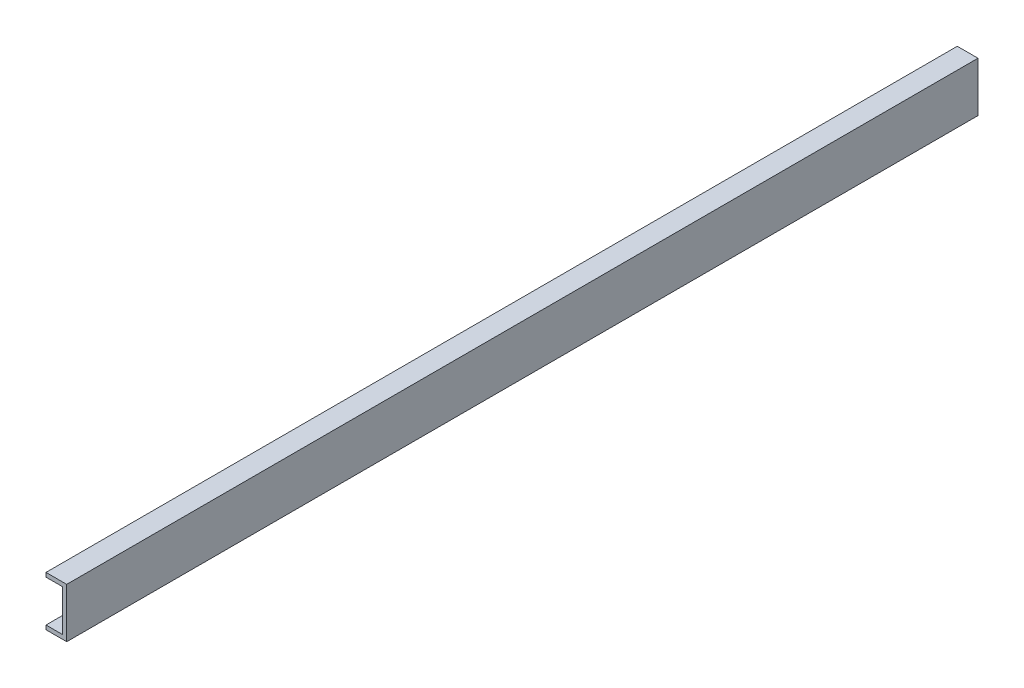
ISO-10303-21;
HEADER;
FILE_DESCRIPTION(('STEP AP214'),'2;1');
FILE_NAME('part.step','',(''),(''),'','','');
FILE_SCHEMA(('AUTOMOTIVE_DESIGN { 1 0 10303 214 1 1 1 1 }'));
ENDSEC;
DATA;
#1=APPLICATION_CONTEXT('core data for automotive mechanical design processes');
#2=APPLICATION_PROTOCOL_DEFINITION('international standard','automotive_design',2000,#1);
#3=PRODUCT_CONTEXT('',#1,'mechanical');
#4=PRODUCT('Part','Part','',(#3));
#5=PRODUCT_RELATED_PRODUCT_CATEGORY('part','',(#4));
#6=PRODUCT_DEFINITION_FORMATION('','',#4);
#7=PRODUCT_DEFINITION_CONTEXT('part definition',#1,'design');
#8=PRODUCT_DEFINITION('design','',#6,#7);
#9=PRODUCT_DEFINITION_SHAPE('','',#8);
#10=(LENGTH_UNIT() NAMED_UNIT(*) SI_UNIT(.MILLI.,.METRE.));
#11=(NAMED_UNIT(*) PLANE_ANGLE_UNIT() SI_UNIT($,.RADIAN.));
#12=(NAMED_UNIT(*) SI_UNIT($,.STERADIAN.) SOLID_ANGLE_UNIT());
#13=UNCERTAINTY_MEASURE_WITH_UNIT(LENGTH_MEASURE(1.E-05),#10,'distance_accuracy_value','');
#14=(GEOMETRIC_REPRESENTATION_CONTEXT(3) GLOBAL_UNCERTAINTY_ASSIGNED_CONTEXT((#13)) GLOBAL_UNIT_ASSIGNED_CONTEXT((#10,
#11,#12)) REPRESENTATION_CONTEXT('',''));
#15=CARTESIAN_POINT('',(0.,0.,0.));
#16=DIRECTION('',(0.,0.,1.));
#17=DIRECTION('',(1.,0.,0.));
#18=AXIS2_PLACEMENT_3D('',#15,#16,#17);
#19=CARTESIAN_POINT('',(-6.35,-15.24,558.8));
#20=DIRECTION('',(1.,0.,0.));
#21=DIRECTION('',(0.,0.,-1.));
#22=AXIS2_PLACEMENT_3D('',#19,#20,#21);
#23=PLANE('',#22);
#24=DIRECTION('',(0.,-1.,0.));
#25=VECTOR('',#24,1.);
#26=CARTESIAN_POINT('',(-6.35,-15.24,0.));
#27=LINE('',#26,#25);
#28=CARTESIAN_POINT('',(-6.35,15.24,0.));
#29=VERTEX_POINT('',#28);
#30=CARTESIAN_POINT('',(-6.35,12.7,0.));
#31=VERTEX_POINT('',#30);
#32=EDGE_CURVE('E132',#29,#31,#27,.T.);
#33=ORIENTED_EDGE('',*,*,#32,.T.);
#34=DIRECTION('',(0.,0.,1.));
#35=VECTOR('',#34,1.);
#36=CARTESIAN_POINT('',(-6.35,12.7,0.));
#37=LINE('',#36,#35);
#38=CARTESIAN_POINT('',(-6.35,12.7,558.8));
#39=VERTEX_POINT('',#38);
#40=EDGE_CURVE('E163',#31,#39,#37,.T.);
#41=ORIENTED_EDGE('',*,*,#40,.T.);
#42=DIRECTION('',(0.,-1.,0.));
#43=VECTOR('',#42,1.);
#44=CARTESIAN_POINT('',(-6.35,-15.24,558.8));
#45=LINE('',#44,#43);
#46=CARTESIAN_POINT('',(-6.35,15.24,558.8));
#47=VERTEX_POINT('',#46);
#48=EDGE_CURVE('E151',#47,#39,#45,.T.);
#49=ORIENTED_EDGE('',*,*,#48,.F.);
#50=DIRECTION('',(0.,0.,-1.));
#51=VECTOR('',#50,1.);
#52=CARTESIAN_POINT('',(-6.35,15.24,558.8));
#53=LINE('',#52,#51);
#54=EDGE_CURVE('E45',#47,#29,#53,.T.);
#55=ORIENTED_EDGE('',*,*,#54,.T.);
#56=EDGE_LOOP('',(#33,#41,#49,#55));
#57=FACE_BOUND('',#56,.T.);
#58=ADVANCED_FACE('F37',(#57),#23,.F.);
#59=CARTESIAN_POINT('',(6.35,-15.24,558.8));
#60=DIRECTION('',(-1.,0.,0.));
#61=DIRECTION('',(0.,0.,1.));
#62=AXIS2_PLACEMENT_3D('',#59,#60,#61);
#63=PLANE('',#62);
#64=DIRECTION('',(0.,1.,0.));
#65=VECTOR('',#64,1.);
#66=CARTESIAN_POINT('',(6.35,-15.24,0.));
#67=LINE('',#66,#65);
#68=CARTESIAN_POINT('',(6.35,-15.24,0.));
#69=VERTEX_POINT('',#68);
#70=CARTESIAN_POINT('',(6.35,15.24,0.));
#71=VERTEX_POINT('',#70);
#72=EDGE_CURVE('E136',#69,#71,#67,.T.);
#73=ORIENTED_EDGE('',*,*,#72,.T.);
#74=DIRECTION('',(0.,0.,-1.));
#75=VECTOR('',#74,1.);
#76=CARTESIAN_POINT('',(6.35,15.24,558.8));
#77=LINE('',#76,#75);
#78=CARTESIAN_POINT('',(6.35,15.24,558.8));
#79=VERTEX_POINT('',#78);
#80=EDGE_CURVE('E11',#79,#71,#77,.T.);
#81=ORIENTED_EDGE('',*,*,#80,.F.);
#82=DIRECTION('',(0.,1.,0.));
#83=VECTOR('',#82,1.);
#84=CARTESIAN_POINT('',(6.35,-15.24,558.8));
#85=LINE('',#84,#83);
#86=CARTESIAN_POINT('',(6.35,-15.24,558.8));
#87=VERTEX_POINT('',#86);
#88=EDGE_CURVE('E141',#87,#79,#85,.T.);
#89=ORIENTED_EDGE('',*,*,#88,.F.);
#90=DIRECTION('',(0.,0.,-1.));
#91=VECTOR('',#90,1.);
#92=CARTESIAN_POINT('',(6.35,-15.24,558.8));
#93=LINE('',#92,#91);
#94=EDGE_CURVE('E142',#87,#69,#93,.T.);
#95=ORIENTED_EDGE('',*,*,#94,.T.);
#96=EDGE_LOOP('',(#73,#81,#89,#95));
#97=FACE_BOUND('',#96,.T.);
#98=ADVANCED_FACE('F39',(#97),#63,.F.);
#99=CARTESIAN_POINT('',(-6.35,15.24,558.8));
#100=DIRECTION('',(0.,-1.,0.));
#101=DIRECTION('',(0.,0.,-1.));
#102=AXIS2_PLACEMENT_3D('',#99,#100,#101);
#103=PLANE('',#102);
#104=DIRECTION('',(-1.,0.,0.));
#105=VECTOR('',#104,1.);
#106=CARTESIAN_POINT('',(-6.35,15.24,0.));
#107=LINE('',#106,#105);
#108=EDGE_CURVE('E133',#71,#29,#107,.T.);
#109=ORIENTED_EDGE('',*,*,#108,.T.);
#110=ORIENTED_EDGE('',*,*,#54,.F.);
#111=DIRECTION('',(-1.,0.,0.));
#112=VECTOR('',#111,1.);
#113=CARTESIAN_POINT('',(-6.35,15.24,558.8));
#114=LINE('',#113,#112);
#115=EDGE_CURVE('E89',#79,#47,#114,.T.);
#116=ORIENTED_EDGE('',*,*,#115,.F.);
#117=ORIENTED_EDGE('',*,*,#80,.T.);
#118=EDGE_LOOP('',(#109,#110,#116,#117));
#119=FACE_BOUND('',#118,.T.);
#120=ADVANCED_FACE('F184',(#119),#103,.F.);
#121=CARTESIAN_POINT('',(-6.34999999999999,-12.7,558.8));
#122=VERTEX_POINT('',#121);
#123=CARTESIAN_POINT('',(-6.35,-15.24,558.8));
#124=VERTEX_POINT('',#123);
#125=EDGE_CURVE('E126',#122,#124,#45,.T.);
#126=ORIENTED_EDGE('',*,*,#125,.F.);
#127=DIRECTION('',(0.,0.,1.));
#128=VECTOR('',#127,1.);
#129=CARTESIAN_POINT('',(-6.34999999999999,-12.7,0.));
#130=LINE('',#129,#128);
#131=CARTESIAN_POINT('',(-6.34999999999999,-12.7,0.));
#132=VERTEX_POINT('',#131);
#133=EDGE_CURVE('E114',#132,#122,#130,.T.);
#134=ORIENTED_EDGE('',*,*,#133,.F.);
#135=CARTESIAN_POINT('',(-6.35,-15.24,0.));
#136=VERTEX_POINT('',#135);
#137=EDGE_CURVE('E125',#132,#136,#27,.T.);
#138=ORIENTED_EDGE('',*,*,#137,.T.);
#139=DIRECTION('',(0.,0.,-1.));
#140=VECTOR('',#139,1.);
#141=CARTESIAN_POINT('',(-6.35,-15.24,558.8));
#142=LINE('',#141,#140);
#143=EDGE_CURVE('E144',#124,#136,#142,.T.);
#144=ORIENTED_EDGE('',*,*,#143,.F.);
#145=EDGE_LOOP('',(#126,#134,#138,#144));
#146=FACE_BOUND('',#145,.T.);
#147=ADVANCED_FACE('F123',(#146),#23,.F.);
#148=CARTESIAN_POINT('',(-6.35,-15.24,558.8));
#149=DIRECTION('',(0.,1.,0.));
#150=DIRECTION('',(0.,0.,1.));
#151=AXIS2_PLACEMENT_3D('',#148,#149,#150);
#152=PLANE('',#151);
#153=DIRECTION('',(1.,0.,0.));
#154=VECTOR('',#153,1.);
#155=CARTESIAN_POINT('',(-6.35,-15.24,0.));
#156=LINE('',#155,#154);
#157=EDGE_CURVE('E82',#136,#69,#156,.T.);
#158=ORIENTED_EDGE('',*,*,#157,.T.);
#159=ORIENTED_EDGE('',*,*,#94,.F.);
#160=DIRECTION('',(1.,0.,0.));
#161=VECTOR('',#160,1.);
#162=CARTESIAN_POINT('',(-6.35,-15.24,558.8));
#163=LINE('',#162,#161);
#164=EDGE_CURVE('E61',#124,#87,#163,.T.);
#165=ORIENTED_EDGE('',*,*,#164,.F.);
#166=ORIENTED_EDGE('',*,*,#143,.T.);
#167=EDGE_LOOP('',(#158,#159,#165,#166));
#168=FACE_BOUND('',#167,.T.);
#169=ADVANCED_FACE('F175',(#168),#152,.F.);
#170=CARTESIAN_POINT('',(0.,0.,558.8));
#171=DIRECTION('',(0.,0.,-1.));
#172=DIRECTION('',(-1.,0.,0.));
#173=AXIS2_PLACEMENT_3D('',#170,#171,#172);
#174=PLANE('',#173);
#175=ORIENTED_EDGE('',*,*,#48,.T.);
#176=DIRECTION('',(-1.,0.,0.));
#177=VECTOR('',#176,1.);
#178=CARTESIAN_POINT('',(-6.35,12.7,558.8));
#179=LINE('',#178,#177);
#180=CARTESIAN_POINT('',(3.81,12.7,558.8));
#181=VERTEX_POINT('',#180);
#182=EDGE_CURVE('E119',#181,#39,#179,.T.);
#183=ORIENTED_EDGE('',*,*,#182,.F.);
#184=DIRECTION('',(0.,1.,0.));
#185=VECTOR('',#184,1.);
#186=CARTESIAN_POINT('',(3.81,12.7,558.8));
#187=LINE('',#186,#185);
#188=CARTESIAN_POINT('',(3.81000000000001,-12.7,558.8));
#189=VERTEX_POINT('',#188);
#190=EDGE_CURVE('E159',#189,#181,#187,.T.);
#191=ORIENTED_EDGE('',*,*,#190,.F.);
#192=DIRECTION('',(1.,0.,0.));
#193=VECTOR('',#192,1.);
#194=CARTESIAN_POINT('',(-6.34999999999999,-12.7,558.8));
#195=LINE('',#194,#193);
#196=EDGE_CURVE('E157',#122,#189,#195,.T.);
#197=ORIENTED_EDGE('',*,*,#196,.F.);
#198=ORIENTED_EDGE('',*,*,#125,.T.);
#199=ORIENTED_EDGE('',*,*,#164,.T.);
#200=ORIENTED_EDGE('',*,*,#88,.T.);
#201=ORIENTED_EDGE('',*,*,#115,.T.);
#202=EDGE_LOOP('',(#175,#183,#191,#197,#198,#199,#200,#201));
#203=FACE_BOUND('',#202,.T.);
#204=ADVANCED_FACE('F177',(#203),#174,.F.);
#205=CARTESIAN_POINT('',(0.,0.,0.));
#206=DIRECTION('',(0.,0.,-1.));
#207=DIRECTION('',(-1.,0.,0.));
#208=AXIS2_PLACEMENT_3D('',#205,#206,#207);
#209=PLANE('',#208);
#210=DIRECTION('',(-1.,0.,0.));
#211=VECTOR('',#210,1.);
#212=CARTESIAN_POINT('',(-6.35,12.7,0.));
#213=LINE('',#212,#211);
#214=CARTESIAN_POINT('',(3.81,12.7,0.));
#215=VERTEX_POINT('',#214);
#216=EDGE_CURVE('E127',#215,#31,#213,.T.);
#217=ORIENTED_EDGE('',*,*,#216,.T.);
#218=ORIENTED_EDGE('',*,*,#32,.F.);
#219=ORIENTED_EDGE('',*,*,#108,.F.);
#220=ORIENTED_EDGE('',*,*,#72,.F.);
#221=ORIENTED_EDGE('',*,*,#157,.F.);
#222=ORIENTED_EDGE('',*,*,#137,.F.);
#223=DIRECTION('',(1.,0.,0.));
#224=VECTOR('',#223,1.);
#225=CARTESIAN_POINT('',(-6.34999999999999,-12.7,0.));
#226=LINE('',#225,#224);
#227=CARTESIAN_POINT('',(3.81000000000001,-12.7,0.));
#228=VERTEX_POINT('',#227);
#229=EDGE_CURVE('E110',#132,#228,#226,.T.);
#230=ORIENTED_EDGE('',*,*,#229,.T.);
#231=DIRECTION('',(0.,1.,0.));
#232=VECTOR('',#231,1.);
#233=CARTESIAN_POINT('',(3.81,12.7,0.));
#234=LINE('',#233,#232);
#235=EDGE_CURVE('E52',#228,#215,#234,.T.);
#236=ORIENTED_EDGE('',*,*,#235,.T.);
#237=EDGE_LOOP('',(#217,#218,#219,#220,#221,#222,#230,#236));
#238=FACE_BOUND('',#237,.T.);
#239=ADVANCED_FACE('F130',(#238),#209,.T.);
#240=CARTESIAN_POINT('',(-6.35,12.7,0.));
#241=DIRECTION('',(0.,1.,0.));
#242=DIRECTION('',(0.,0.,1.));
#243=AXIS2_PLACEMENT_3D('',#240,#241,#242);
#244=PLANE('',#243);
#245=ORIENTED_EDGE('',*,*,#182,.T.);
#246=ORIENTED_EDGE('',*,*,#40,.F.);
#247=ORIENTED_EDGE('',*,*,#216,.F.);
#248=DIRECTION('',(0.,0.,1.));
#249=VECTOR('',#248,1.);
#250=CARTESIAN_POINT('',(3.81,12.7,0.));
#251=LINE('',#250,#249);
#252=EDGE_CURVE('E165',#215,#181,#251,.T.);
#253=ORIENTED_EDGE('',*,*,#252,.T.);
#254=EDGE_LOOP('',(#245,#246,#247,#253));
#255=FACE_BOUND('',#254,.T.);
#256=ADVANCED_FACE('F220',(#255),#244,.F.);
#257=CARTESIAN_POINT('',(3.81,12.7,0.));
#258=DIRECTION('',(1.,0.,0.));
#259=DIRECTION('',(0.,1.,0.));
#260=AXIS2_PLACEMENT_3D('',#257,#258,#259);
#261=PLANE('',#260);
#262=ORIENTED_EDGE('',*,*,#190,.T.);
#263=ORIENTED_EDGE('',*,*,#252,.F.);
#264=ORIENTED_EDGE('',*,*,#235,.F.);
#265=DIRECTION('',(0.,0.,1.));
#266=VECTOR('',#265,1.);
#267=CARTESIAN_POINT('',(3.81000000000001,-12.7,0.));
#268=LINE('',#267,#266);
#269=EDGE_CURVE('E116',#228,#189,#268,.T.);
#270=ORIENTED_EDGE('',*,*,#269,.T.);
#271=EDGE_LOOP('',(#262,#263,#264,#270));
#272=FACE_BOUND('',#271,.T.);
#273=ADVANCED_FACE('F230',(#272),#261,.F.);
#274=CARTESIAN_POINT('',(-6.34999999999999,-12.7,0.));
#275=DIRECTION('',(0.,-1.,0.));
#276=DIRECTION('',(0.,0.,-1.));
#277=AXIS2_PLACEMENT_3D('',#274,#275,#276);
#278=PLANE('',#277);
#279=ORIENTED_EDGE('',*,*,#196,.T.);
#280=ORIENTED_EDGE('',*,*,#269,.F.);
#281=ORIENTED_EDGE('',*,*,#229,.F.);
#282=ORIENTED_EDGE('',*,*,#133,.T.);
#283=EDGE_LOOP('',(#279,#280,#281,#282));
#284=FACE_BOUND('',#283,.T.);
#285=ADVANCED_FACE('F113',(#284),#278,.F.);
#286=CLOSED_SHELL('',(#58,#98,#120,#147,#169,#204,#239,#256,#273,#285));
#287=MANIFOLD_SOLID_BREP('B2',#286);
#288=ADVANCED_BREP_SHAPE_REPRESENTATION('',(#18,#287),#14);
#289=SHAPE_DEFINITION_REPRESENTATION(#9,#288);
ENDSEC;
END-ISO-10303-21;
